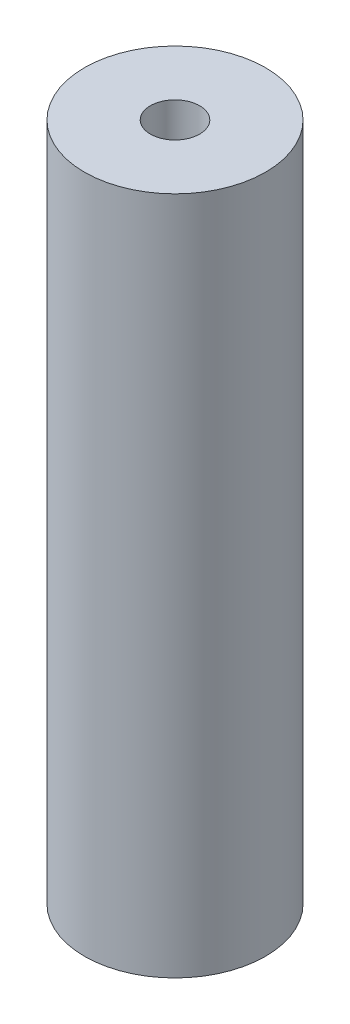
ISO-10303-21;
HEADER;
FILE_DESCRIPTION(('STEP AP214'),'2;1');
FILE_NAME('part.step','',(''),(''),'','','');
FILE_SCHEMA(('AUTOMOTIVE_DESIGN { 1 0 10303 214 1 1 1 1 }'));
ENDSEC;
DATA;
#1=APPLICATION_CONTEXT('core data for automotive mechanical design processes');
#2=APPLICATION_PROTOCOL_DEFINITION('international standard','automotive_design',2000,#1);
#3=PRODUCT_CONTEXT('',#1,'mechanical');
#4=PRODUCT('Part','Part','',(#3));
#5=PRODUCT_RELATED_PRODUCT_CATEGORY('part','',(#4));
#6=PRODUCT_DEFINITION_FORMATION('','',#4);
#7=PRODUCT_DEFINITION_CONTEXT('part definition',#1,'design');
#8=PRODUCT_DEFINITION('design','',#6,#7);
#9=PRODUCT_DEFINITION_SHAPE('','',#8);
#10=(LENGTH_UNIT() NAMED_UNIT(*) SI_UNIT(.MILLI.,.METRE.));
#11=(NAMED_UNIT(*) PLANE_ANGLE_UNIT() SI_UNIT($,.RADIAN.));
#12=(NAMED_UNIT(*) SI_UNIT($,.STERADIAN.) SOLID_ANGLE_UNIT());
#13=UNCERTAINTY_MEASURE_WITH_UNIT(LENGTH_MEASURE(1.E-05),#10,'distance_accuracy_value','');
#14=(GEOMETRIC_REPRESENTATION_CONTEXT(3) GLOBAL_UNCERTAINTY_ASSIGNED_CONTEXT((#13)) GLOBAL_UNIT_ASSIGNED_CONTEXT((#10,
#11,#12)) REPRESENTATION_CONTEXT('',''));
#15=CARTESIAN_POINT('',(0.,0.,0.));
#16=DIRECTION('',(0.,0.,1.));
#17=DIRECTION('',(1.,0.,0.));
#18=AXIS2_PLACEMENT_3D('',#15,#16,#17);
#19=CARTESIAN_POINT('',(0.,23.8125,0.));
#20=DIRECTION('',(0.,1.,0.));
#21=DIRECTION('',(0.,0.,1.));
#22=AXIS2_PLACEMENT_3D('',#19,#20,#21);
#23=PLANE('',#22);
#24=CARTESIAN_POINT('',(0.,23.8125,0.));
#25=DIRECTION('',(0.,1.,0.));
#26=DIRECTION('',(0.,0.,1.));
#27=AXIS2_PLACEMENT_3D('',#24,#25,#26);
#28=CIRCLE('',#27,6.35);
#29=CARTESIAN_POINT('',(0.,23.8125,6.35));
#30=VERTEX_POINT('',#29);
#31=EDGE_CURVE('E10',#30,#30,#28,.T.);
#32=ORIENTED_EDGE('',*,*,#31,.T.);
#33=EDGE_LOOP('',(#32));
#34=FACE_BOUND('',#33,.T.);
#35=CARTESIAN_POINT('',(0.,23.8125,0.));
#36=DIRECTION('',(0.,1.,0.));
#37=DIRECTION('',(0.,0.,1.));
#38=AXIS2_PLACEMENT_3D('',#35,#36,#37);
#39=CIRCLE('',#38,1.7272);
#40=CARTESIAN_POINT('',(0.,23.8125,1.7272));
#41=VERTEX_POINT('',#40);
#42=EDGE_CURVE('E41',#41,#41,#39,.T.);
#43=ORIENTED_EDGE('',*,*,#42,.F.);
#44=EDGE_LOOP('',(#43));
#45=FACE_BOUND('',#44,.T.);
#46=ADVANCED_FACE('F30',(#34,#45),#23,.T.);
#47=CARTESIAN_POINT('',(0.,-23.8125,0.));
#48=DIRECTION('',(0.,1.,0.));
#49=DIRECTION('',(0.,0.,1.));
#50=AXIS2_PLACEMENT_3D('',#47,#48,#49);
#51=PLANE('',#50);
#52=CARTESIAN_POINT('',(0.,-23.8125,0.));
#53=DIRECTION('',(0.,1.,0.));
#54=DIRECTION('',(0.,0.,1.));
#55=AXIS2_PLACEMENT_3D('',#52,#53,#54);
#56=CIRCLE('',#55,6.35);
#57=CARTESIAN_POINT('',(0.,-23.8125,6.35));
#58=VERTEX_POINT('',#57);
#59=EDGE_CURVE('E34',#58,#58,#56,.T.);
#60=ORIENTED_EDGE('',*,*,#59,.F.);
#61=EDGE_LOOP('',(#60));
#62=FACE_BOUND('',#61,.T.);
#63=CARTESIAN_POINT('',(0.,-23.8125,0.));
#64=DIRECTION('',(0.,1.,0.));
#65=DIRECTION('',(0.,0.,1.));
#66=AXIS2_PLACEMENT_3D('',#63,#64,#65);
#67=CIRCLE('',#66,1.7272);
#68=CARTESIAN_POINT('',(0.,-23.8125,1.7272));
#69=VERTEX_POINT('',#68);
#70=EDGE_CURVE('E43',#69,#69,#67,.T.);
#71=ORIENTED_EDGE('',*,*,#70,.T.);
#72=EDGE_LOOP('',(#71));
#73=FACE_BOUND('',#72,.T.);
#74=ADVANCED_FACE('F53',(#62,#73),#51,.F.);
#75=CARTESIAN_POINT('',(0.,23.8125,0.));
#76=DIRECTION('',(0.,-1.,0.));
#77=DIRECTION('',(0.,0.,-1.));
#78=AXIS2_PLACEMENT_3D('',#75,#76,#77);
#79=CYLINDRICAL_SURFACE('',#78,6.35);
#80=ORIENTED_EDGE('',*,*,#31,.F.);
#81=EDGE_LOOP('',(#80));
#82=FACE_BOUND('',#81,.T.);
#83=ORIENTED_EDGE('',*,*,#59,.T.);
#84=EDGE_LOOP('',(#83));
#85=FACE_BOUND('',#84,.T.);
#86=ADVANCED_FACE('F32',(#82,#85),#79,.T.);
#87=CARTESIAN_POINT('',(0.,23.8125,0.));
#88=DIRECTION('',(0.,-1.,0.));
#89=DIRECTION('',(0.,0.,-1.));
#90=AXIS2_PLACEMENT_3D('',#87,#88,#89);
#91=CYLINDRICAL_SURFACE('',#90,1.7272);
#92=ORIENTED_EDGE('',*,*,#42,.T.);
#93=EDGE_LOOP('',(#92));
#94=FACE_BOUND('',#93,.T.);
#95=ORIENTED_EDGE('',*,*,#70,.F.);
#96=EDGE_LOOP('',(#95));
#97=FACE_BOUND('',#96,.T.);
#98=ADVANCED_FACE('F49',(#94,#97),#91,.F.);
#99=CLOSED_SHELL('',(#46,#74,#86,#98));
#100=MANIFOLD_SOLID_BREP('B2',#99);
#101=ADVANCED_BREP_SHAPE_REPRESENTATION('',(#18,#100),#14);
#102=SHAPE_DEFINITION_REPRESENTATION(#9,#101);
ENDSEC;
END-ISO-10303-21;
